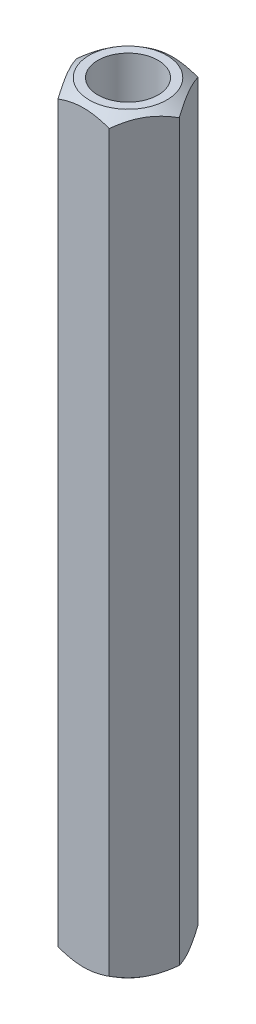
ISO-10303-21;
HEADER;
FILE_DESCRIPTION(('STEP AP214'),'2;1');
FILE_NAME('part.step','',(''),(''),'','','');
FILE_SCHEMA(('AUTOMOTIVE_DESIGN { 1 0 10303 214 1 1 1 1 }'));
ENDSEC;
DATA;
#1=APPLICATION_CONTEXT('core data for automotive mechanical design processes');
#2=APPLICATION_PROTOCOL_DEFINITION('international standard','automotive_design',2000,#1);
#3=PRODUCT_CONTEXT('',#1,'mechanical');
#4=PRODUCT('Part','Part','',(#3));
#5=PRODUCT_RELATED_PRODUCT_CATEGORY('part','',(#4));
#6=PRODUCT_DEFINITION_FORMATION('','',#4);
#7=PRODUCT_DEFINITION_CONTEXT('part definition',#1,'design');
#8=PRODUCT_DEFINITION('design','',#6,#7);
#9=PRODUCT_DEFINITION_SHAPE('','',#8);
#10=(LENGTH_UNIT() NAMED_UNIT(*) SI_UNIT(.MILLI.,.METRE.));
#11=(NAMED_UNIT(*) PLANE_ANGLE_UNIT() SI_UNIT($,.RADIAN.));
#12=(NAMED_UNIT(*) SI_UNIT($,.STERADIAN.) SOLID_ANGLE_UNIT());
#13=UNCERTAINTY_MEASURE_WITH_UNIT(LENGTH_MEASURE(1.E-05),#10,'distance_accuracy_value','');
#14=(GEOMETRIC_REPRESENTATION_CONTEXT(3) GLOBAL_UNCERTAINTY_ASSIGNED_CONTEXT((#13)) GLOBAL_UNIT_ASSIGNED_CONTEXT((#10,
#11,#12)) REPRESENTATION_CONTEXT('',''));
#15=CARTESIAN_POINT('',(0.,0.,0.));
#16=DIRECTION('',(0.,0.,1.));
#17=DIRECTION('',(1.,0.,0.));
#18=AXIS2_PLACEMENT_3D('',#15,#16,#17);
#19=CARTESIAN_POINT('',(-1.7031832941094,50.,2.95));
#20=DIRECTION('',(0.,0.,-1.));
#21=DIRECTION('',(-1.,0.,0.));
#22=AXIS2_PLACEMENT_3D('',#19,#20,#21);
#23=PLANE('',#22);
#24=CARTESIAN_POINT('',(-4.05461232529674,48.2277686620064,2.95));
#25=CARTESIAN_POINT('',(-3.94621271231721,48.2914609210598,2.95));
#26=CARTESIAN_POINT('',(-3.837435847718,48.354522032527,2.95));
#27=CARTESIAN_POINT('',(-3.61895112298373,48.4790602429143,2.95));
#28=CARTESIAN_POINT('',(-3.50924307990902,48.5405370205299,2.95));
#29=CARTESIAN_POINT('',(-3.28804663612024,48.6619521609706,2.95));
#30=CARTESIAN_POINT('',(-3.17655129885157,48.7218779306985,2.95));
#31=CARTESIAN_POINT('',(-2.95229456012626,48.839303804544,2.95));
#32=CARTESIAN_POINT('',(-2.83953323129652,48.896804046917,2.95));
#33=CARTESIAN_POINT('',(-2.60770322605176,49.0111600537194,2.95));
#34=CARTESIAN_POINT('',(-2.48856977859005,49.0678852179029,2.95));
#35=CARTESIAN_POINT('',(-2.2483802067534,49.1771793231946,2.95));
#36=CARTESIAN_POINT('',(-2.12732383873497,49.229747732495,2.95));
#37=CARTESIAN_POINT('',(-1.8833121988441,49.3294459262429,2.95));
#38=CARTESIAN_POINT('',(-1.76036221516992,49.3765885306905,2.95));
#39=CARTESIAN_POINT('',(-1.51209893737175,49.4641079950337,2.95));
#40=CARTESIAN_POINT('',(-1.38678651289328,49.5044872925027,2.95));
#41=CARTESIAN_POINT('',(-1.12793775016924,49.5783931262297,2.95));
#42=CARTESIAN_POINT('',(-0.994286484547427,49.6115248217331,2.95));
#43=CARTESIAN_POINT('',(-0.724624612015141,49.6663377671345,2.95));
#44=CARTESIAN_POINT('',(-0.588614424081831,49.6880210293505,2.95));
#45=CARTESIAN_POINT('',(-0.317321711369485,49.7178689506704,2.95));
#46=CARTESIAN_POINT('',(-0.182063385223632,49.7262479355804,2.95));
#47=CARTESIAN_POINT('',(0.0886210559395453,49.7293612756643,2.95));
#48=CARTESIAN_POINT('',(0.224047174535356,49.7240953346481,2.95));
#49=CARTESIAN_POINT('',(0.482831942094902,49.7013906234424,2.95));
#50=CARTESIAN_POINT('',(0.606283120828392,49.6849676346196,2.95));
#51=CARTESIAN_POINT('',(0.851432997279108,49.6422336449972,2.95));
#52=CARTESIAN_POINT('',(0.973131613989001,49.6159221886441,2.95));
#53=CARTESIAN_POINT('',(1.21671308523253,49.554380559434,2.95));
#54=CARTESIAN_POINT('',(1.33855451810658,49.518988677576,2.95));
#55=CARTESIAN_POINT('',(1.51958072119215,49.4606517843694,2.95));
#56=CARTESIAN_POINT('',(1.5796325615635,49.4403316582886,2.95));
#57=CARTESIAN_POINT('',(1.6991806344264,49.3981238889795,2.95));
#58=CARTESIAN_POINT('',(1.75867689129756,49.3762363149014,2.95));
#59=CARTESIAN_POINT('',(1.94593537324239,49.304836423385,2.95));
#60=CARTESIAN_POINT('',(2.07272450894271,49.2527656618048,2.95));
#61=CARTESIAN_POINT('',(2.32412427122057,49.1435803755841,2.95));
#62=CARTESIAN_POINT('',(2.44873429467314,49.0864644802367,2.95));
#63=CARTESIAN_POINT('',(2.69619716344165,48.9682559046461,2.95));
#64=CARTESIAN_POINT('',(2.81904813152007,48.9071593134961,2.95));
#65=CARTESIAN_POINT('',(3.06315160061721,48.7818944847195,2.95));
#66=CARTESIAN_POINT('',(3.18440424672197,48.7177265283761,2.95));
#67=CARTESIAN_POINT('',(3.42614112560949,48.5866493682499,2.95));
#68=CARTESIAN_POINT('',(3.54661920487956,48.5197288520524,2.95));
#69=CARTESIAN_POINT('',(3.78645737066542,48.3839102145454,2.95));
#70=CARTESIAN_POINT('',(3.90581741936779,48.3150120266663,2.95));
#71=CARTESIAN_POINT('',(4.26236561852274,48.1060127891548,2.95));
#72=CARTESIAN_POINT('',(4.49815806704329,47.9635320189086,2.95));
#73=CARTESIAN_POINT('',(4.9413519549688,47.6901559535697,2.95));
#74=CARTESIAN_POINT('',(5.14902965679854,47.5597049345302,2.95));
#75=CARTESIAN_POINT('',(5.56281584655362,47.2962746718772,2.95));
#76=CARTESIAN_POINT('',(5.76892410448383,47.1632950673296,2.95));
#77=CARTESIAN_POINT('',(6.17794018033544,46.89674199216,2.95));
#78=CARTESIAN_POINT('',(6.38085972863554,46.7631864735119,2.95));
#79=CARTESIAN_POINT('',(6.78569812956608,46.4946542040007,2.95));
#80=CARTESIAN_POINT('',(6.9876171753043,46.3596777444676,2.95));
#81=CARTESIAN_POINT('',(7.18917863706093,46.2241749072125,2.95));
#82=B_SPLINE_CURVE_WITH_KNOTS('',3,(#24,#25,#26,#27,#28,#29,#30,#31,#32,#33,#34,#35,#36,#37,#38,
#39,#40,#41,#42,#43,#44,#45,#46,#47,#48,#49,#50,#51,#52,#53,#54,#55,#56,#57,#58,#59,#60,#61,#62,
#63,#64,#65,#66,#67,#68,#69,#70,#71,#72,#73,#74,#75,#76,#77,#78,#79,#80,#81),.UNSPECIFIED.,.F.,
.F.,(4,2,2,2,2,2,2,2,2,2,2,2,2,2,2,2,2,2,2,2,2,2,2,2,2,2,2,2,4),(0.,0.377185912204267,
0.754447725599356,1.13416109637235,1.51385279408704,1.90963672952404,2.30547121919885,
2.7003503555372,3.0950868652229,3.50776306676646,3.92036670707722,4.32625348716091,
4.73214907789404,5.10531571028197,5.47849953625807,5.85885647181754,6.04902913686089,
6.23919341733104,6.6502298862926,7.0613783748244,7.47293707920044,7.88445816386253,
8.29788382471786,8.71132341810463,9.53773613971973,10.2734671856936,11.0093040513489,
11.7380779448787,12.4667052231439),.UNSPECIFIED.);
#83=CARTESIAN_POINT('',(-1.7031832941094,49.3963793454497,2.95));
#84=VERTEX_POINT('',#83);
#85=CARTESIAN_POINT('',(1.7031832941094,49.3963793454497,2.95));
#86=VERTEX_POINT('',#85);
#87=EDGE_CURVE('E87',#84,#86,#82,.T.);
#88=ORIENTED_EDGE('',*,*,#87,.F.);
#89=DIRECTION('',(0.,-1.,0.));
#90=VECTOR('',#89,1.);
#91=CARTESIAN_POINT('',(-1.7031832941094,50.,2.95));
#92=LINE('',#91,#90);
#93=CARTESIAN_POINT('',(-1.7031832941094,0.603620654550297,2.95));
#94=VERTEX_POINT('',#93);
#95=EDGE_CURVE('E56',#84,#94,#92,.T.);
#96=ORIENTED_EDGE('',*,*,#95,.T.);
#97=CARTESIAN_POINT('',(-4.05461232529675,1.77223133799356,2.95));
#98=CARTESIAN_POINT('',(-3.94621271231721,1.70853907894017,2.95));
#99=CARTESIAN_POINT('',(-3.837435847718,1.64547796747305,2.95));
#100=CARTESIAN_POINT('',(-3.61895112298373,1.52093975708568,2.95));
#101=CARTESIAN_POINT('',(-3.50924307990903,1.45946297947013,2.95));
#102=CARTESIAN_POINT('',(-3.28804663612024,1.33804783902941,2.95));
#103=CARTESIAN_POINT('',(-3.17655129885157,1.27812206930148,2.95));
#104=CARTESIAN_POINT('',(-2.95229456012626,1.16069619545603,2.95));
#105=CARTESIAN_POINT('',(-2.83953323129652,1.10319595308301,2.95));
#106=CARTESIAN_POINT('',(-2.60770322605176,0.988839946280621,2.95));
#107=CARTESIAN_POINT('',(-2.48856977859005,0.932114782097108,2.95));
#108=CARTESIAN_POINT('',(-2.2483802067534,0.822820676805411,2.95));
#109=CARTESIAN_POINT('',(-2.12732383873497,0.770252267505033,2.95));
#110=CARTESIAN_POINT('',(-1.8833121988441,0.670554073757091,2.95));
#111=CARTESIAN_POINT('',(-1.76036221516992,0.623411469309482,2.95));
#112=CARTESIAN_POINT('',(-1.51209893737175,0.535892004966346,2.95));
#113=CARTESIAN_POINT('',(-1.38678651289328,0.495512707497298,2.95));
#114=CARTESIAN_POINT('',(-1.12793775016924,0.421606873770254,2.95));
#115=CARTESIAN_POINT('',(-0.994286484547427,0.388475178266886,2.95));
#116=CARTESIAN_POINT('',(-0.724624612015141,0.333662232865514,2.95));
#117=CARTESIAN_POINT('',(-0.588614424081831,0.311978970649536,2.95));
#118=CARTESIAN_POINT('',(-0.317321711369485,0.282131049329576,2.95));
#119=CARTESIAN_POINT('',(-0.182063385223632,0.273752064419566,2.95));
#120=CARTESIAN_POINT('',(0.0886210559395456,0.270638724335665,2.95));
#121=CARTESIAN_POINT('',(0.224047174535357,0.275904665351887,2.95));
#122=CARTESIAN_POINT('',(0.482831942094901,0.29860937655757,2.95));
#123=CARTESIAN_POINT('',(0.606283120828391,0.315032365380413,2.95));
#124=CARTESIAN_POINT('',(0.851432997279107,0.357766355002783,2.95));
#125=CARTESIAN_POINT('',(0.973131613989,0.384077811355892,2.95));
#126=CARTESIAN_POINT('',(1.21671308523253,0.445619440565985,2.95));
#127=CARTESIAN_POINT('',(1.33855451810658,0.481011322424028,2.95));
#128=CARTESIAN_POINT('',(1.51958072119215,0.539348215630614,2.95));
#129=CARTESIAN_POINT('',(1.5796325615635,0.559668341711404,2.95));
#130=CARTESIAN_POINT('',(1.6991806344264,0.601876111020508,2.95));
#131=CARTESIAN_POINT('',(1.75867689129756,0.623763685098642,2.95));
#132=CARTESIAN_POINT('',(1.94593537324239,0.695163576615002,2.95));
#133=CARTESIAN_POINT('',(2.07272450894271,0.747234338195169,2.95));
#134=CARTESIAN_POINT('',(2.32412427122057,0.856419624415884,2.95));
#135=CARTESIAN_POINT('',(2.44873429467314,0.913535519763325,2.95));
#136=CARTESIAN_POINT('',(2.69619716344164,1.03174409535388,2.95));
#137=CARTESIAN_POINT('',(2.81904813152007,1.09284068650394,2.95));
#138=CARTESIAN_POINT('',(3.06315160061721,1.21810551528055,2.95));
#139=CARTESIAN_POINT('',(3.18440424672197,1.28227347162389,2.95));
#140=CARTESIAN_POINT('',(3.42614112560949,1.41335063175011,2.95));
#141=CARTESIAN_POINT('',(3.54661920487956,1.48027114794761,2.95));
#142=CARTESIAN_POINT('',(3.78645737066541,1.61608978545456,2.95));
#143=CARTESIAN_POINT('',(3.90581741936779,1.68498797333371,2.95));
#144=CARTESIAN_POINT('',(4.26236561852274,1.89398721084525,2.95));
#145=CARTESIAN_POINT('',(4.49815806704329,2.0364679810914,2.95));
#146=CARTESIAN_POINT('',(4.9413519549688,2.30984404643027,2.95));
#147=CARTESIAN_POINT('',(5.14902965679854,2.44029506546977,2.95));
#148=CARTESIAN_POINT('',(5.56281584655362,2.70372532812276,2.95));
#149=CARTESIAN_POINT('',(5.76892410448382,2.83670493267039,2.95));
#150=CARTESIAN_POINT('',(6.17794018033544,3.10325800784,2.95));
#151=CARTESIAN_POINT('',(6.38085972863554,3.23681352648813,2.95));
#152=CARTESIAN_POINT('',(6.78569812956608,3.50534579599933,2.95));
#153=CARTESIAN_POINT('',(6.9876171753043,3.64032225553239,2.95));
#154=CARTESIAN_POINT('',(7.18917863706093,3.77582509278753,2.95));
#155=B_SPLINE_CURVE_WITH_KNOTS('',3,(#97,#98,#99,#100,#101,#102,#103,#104,#105,#106,#107,#108,
#109,#110,#111,#112,#113,#114,#115,#116,#117,#118,#119,#120,#121,#122,#123,#124,#125,#126,#127,
#128,#129,#130,#131,#132,#133,#134,#135,#136,#137,#138,#139,#140,#141,#142,#143,#144,#145,#146,
#147,#148,#149,#150,#151,#152,#153,#154),.UNSPECIFIED.,.F.,.F.,(4,2,2,2,2,2,2,2,2,2,2,2,2,2,2,2,
2,2,2,2,2,2,2,2,2,2,2,2,4),(0.,0.377185912204268,0.754447725599353,1.13416109637235,
1.51385279408704,1.90963672952404,2.30547121919885,2.7003503555372,3.0950868652229,
3.50776306676646,3.92036670707722,4.32625348716091,4.73214907789404,5.10531571028196,
5.47849953625807,5.85885647181753,6.04902913686089,6.23919341733104,6.6502298862926,
7.06137837482439,7.47293707920044,7.88445816386253,8.29788382471786,8.71132341810463,
9.53773613971974,10.2734671856936,11.0093040513489,11.7380779448787,12.4667052231439),.UNSPECIFIED.);
#156=CARTESIAN_POINT('',(1.7031832941094,0.603620654550297,2.95));
#157=VERTEX_POINT('',#156);
#158=EDGE_CURVE('E158',#157,#94,#155,.F.);
#159=ORIENTED_EDGE('',*,*,#158,.F.);
#160=DIRECTION('',(0.,-1.,0.));
#161=VECTOR('',#160,1.);
#162=CARTESIAN_POINT('',(1.7031832941094,50.,2.95));
#163=LINE('',#162,#161);
#164=EDGE_CURVE('E41',#86,#157,#163,.T.);
#165=ORIENTED_EDGE('',*,*,#164,.F.);
#166=EDGE_LOOP('',(#88,#96,#159,#165));
#167=FACE_BOUND('',#166,.T.);
#168=ADVANCED_FACE('F32',(#167),#23,.F.);
#169=CARTESIAN_POINT('',(1.7031832941094,50.,2.95));
#170=DIRECTION('',(-0.866025403784439,0.,-0.5));
#171=DIRECTION('',(-0.5,0.,0.866025403784439));
#172=AXIS2_PLACEMENT_3D('',#169,#170,#171);
#173=PLANE('',#172);
#174=CARTESIAN_POINT('',(1.70306782405556,49.3962954157984,2.9502));
#175=CARTESIAN_POINT('',(1.77970621045705,49.4519964489669,2.81745842094253));
#176=CARTESIAN_POINT('',(1.85738114151486,49.5028360423618,2.68292149387599));
#177=CARTESIAN_POINT('',(2.01490828956404,49.5914223642712,2.41007646988337));
#178=CARTESIAN_POINT('',(2.09476835702137,49.6291125297827,2.2717547755514));
#179=CARTESIAN_POINT('',(2.25294057782611,49.6863470943256,1.99779245277159));
#180=CARTESIAN_POINT('',(2.33119000824908,49.7065470927573,1.86226046361568));
#181=CARTESIAN_POINT('',(2.44893544842869,49.7233149853333,1.65831937886504));
#182=CARTESIAN_POINT('',(2.48821044965547,49.7266519832533,1.59029308127293));
#183=CARTESIAN_POINT('',(2.56679020518234,49.7287619405938,1.45418895225404));
#184=CARTESIAN_POINT('',(2.60609495733059,49.7275352034545,1.38611112455438));
#185=CARTESIAN_POINT('',(2.7093655095579,49.7183265008372,1.20724128117097));
#186=CARTESIAN_POINT('',(2.77325369114515,49.7065726983295,1.09658370465868));
#187=CARTESIAN_POINT('',(2.90026705653299,49.6719137524718,0.876590102566627));
#188=CARTESIAN_POINT('',(2.96339202090339,49.6490054767584,0.767254457051116));
#189=CARTESIAN_POINT('',(3.05834081789005,49.607008810721,0.602798316552675));
#190=CARTESIAN_POINT('',(3.09056559618572,49.5914141976082,0.546983363281939));
#191=CARTESIAN_POINT('',(3.15470346140481,49.5579163092915,0.435893322033459));
#192=CARTESIAN_POINT('',(3.18661664853758,49.5400138045173,0.380618060488058));
#193=CARTESIAN_POINT('',(3.25003080045298,49.5021938973924,0.270781527451697));
#194=CARTESIAN_POINT('',(3.28153275054044,49.4822830545909,0.216218549362707));
#195=CARTESIAN_POINT('',(3.34423406533642,49.4406172200057,0.107616686434712));
#196=CARTESIAN_POINT('',(3.37543340165151,49.4188620570047,0.0535778507745416));
#197=CARTESIAN_POINT('',(3.40648205827263,49.3962954157984,-0.000200000000000313));
#198=B_SPLINE_CURVE_WITH_KNOTS('',3,(#174,#175,#176,#177,#178,#179,#180,#181,#182,#183,#184,
#185,#186,#187,#188,#189,#190,#191,#192,#193,#194,#195,#196,#197),.UNSPECIFIED.,.F.,.F.,(4,2,2,
2,2,2,2,2,2,2,2,4),(0.,0.489602434305842,0.981285680305235,1.45362365908862,1.6893705060195,
1.92510167855345,2.30947632253454,2.69395896767855,2.8928513374988,3.09167748336949,
3.28987405815011,3.48808905269054),.UNSPECIFIED.);
#199=CARTESIAN_POINT('',(3.40636658821879,49.3963793454497,0.));
#200=VERTEX_POINT('',#199);
#201=EDGE_CURVE('E94',#86,#200,#198,.T.);
#202=ORIENTED_EDGE('',*,*,#201,.F.);
#203=ORIENTED_EDGE('',*,*,#164,.T.);
#204=CARTESIAN_POINT('',(3.40648205827263,0.603704584201615,-0.000200000000000409));
#205=CARTESIAN_POINT('',(3.32984367187114,0.54800355103306,0.132541579057473));
#206=CARTESIAN_POINT('',(3.25216874081333,0.49716395763824,0.267078506124008));
#207=CARTESIAN_POINT('',(3.09464159276415,0.408577635728791,0.539923530116624));
#208=CARTESIAN_POINT('',(3.01478152530682,0.370887470217291,0.678245224448596));
#209=CARTESIAN_POINT('',(2.85660930450208,0.313652905674349,0.952207547228405));
#210=CARTESIAN_POINT('',(2.77835987407911,0.293452907242673,1.08773953638432));
#211=CARTESIAN_POINT('',(2.6606144338995,0.276685014666744,1.29168062113496));
#212=CARTESIAN_POINT('',(2.62133943267272,0.273348016746704,1.35970691872707));
#213=CARTESIAN_POINT('',(2.54275967714585,0.271238059406191,1.49581104774596));
#214=CARTESIAN_POINT('',(2.5034549249976,0.272464796545505,1.56388887544562));
#215=CARTESIAN_POINT('',(2.40018437277029,0.281673499162782,1.74275871882903));
#216=CARTESIAN_POINT('',(2.33629619118304,0.293427301670511,1.85341629534132));
#217=CARTESIAN_POINT('',(2.2092828257952,0.328086247528173,2.07340989743337));
#218=CARTESIAN_POINT('',(2.1461578614248,0.350994523241586,2.18274554294888));
#219=CARTESIAN_POINT('',(2.05120906443814,0.392991189279003,2.34720168344732));
#220=CARTESIAN_POINT('',(2.01898428614247,0.408585802391812,2.40301663671806));
#221=CARTESIAN_POINT('',(1.95484642092337,0.442083690708495,2.51410667796654));
#222=CARTESIAN_POINT('',(1.92293323379061,0.459986195482685,2.56938193951194));
#223=CARTESIAN_POINT('',(1.85951908187521,0.497806102607591,2.6792184725483));
#224=CARTESIAN_POINT('',(1.82801713178775,0.517716945409077,2.73378145063729));
#225=CARTESIAN_POINT('',(1.76531581699177,0.559382779994263,2.84238331356529));
#226=CARTESIAN_POINT('',(1.73411648067668,0.581137942995335,2.89642214922546));
#227=CARTESIAN_POINT('',(1.70306782405556,0.603704584201615,2.9502));
#228=B_SPLINE_CURVE_WITH_KNOTS('',3,(#204,#205,#206,#207,#208,#209,#210,#211,#212,#213,#214,
#215,#216,#217,#218,#219,#220,#221,#222,#223,#224,#225,#226,#227),.UNSPECIFIED.,.F.,.F.,(4,2,2,
2,2,2,2,2,2,2,2,4),(0.,0.489602434305841,0.981285680305235,1.45362365908862,1.6893705060195,
1.92510167855345,2.30947632253454,2.69395896767855,2.8928513374988,3.09167748336949,
3.28987405815011,3.48808905269054),.UNSPECIFIED.);
#229=CARTESIAN_POINT('',(3.40636658821879,0.603620654550297,0.));
#230=VERTEX_POINT('',#229);
#231=EDGE_CURVE('E153',#230,#157,#228,.T.);
#232=ORIENTED_EDGE('',*,*,#231,.F.);
#233=DIRECTION('',(0.,-1.,0.));
#234=VECTOR('',#233,1.);
#235=CARTESIAN_POINT('',(3.40636658821879,50.,0.));
#236=LINE('',#235,#234);
#237=EDGE_CURVE('E111',#200,#230,#236,.T.);
#238=ORIENTED_EDGE('',*,*,#237,.F.);
#239=EDGE_LOOP('',(#202,#203,#232,#238));
#240=FACE_BOUND('',#239,.T.);
#241=ADVANCED_FACE('F163',(#240),#173,.F.);
#242=CARTESIAN_POINT('',(3.40636658821879,50.,0.));
#243=DIRECTION('',(-0.866025403784439,0.,0.5));
#244=DIRECTION('',(0.5,0.,0.866025403784439));
#245=AXIS2_PLACEMENT_3D('',#242,#243,#244);
#246=PLANE('',#245);
#247=CARTESIAN_POINT('',(3.40648205827263,49.3962954157984,0.000199999999999513));
#248=CARTESIAN_POINT('',(3.32984367187114,49.4519964489669,-0.132541579057475));
#249=CARTESIAN_POINT('',(3.25216874081333,49.5028360423618,-0.26707850612401));
#250=CARTESIAN_POINT('',(3.09464159276415,49.5914223642712,-0.539923530116626));
#251=CARTESIAN_POINT('',(3.01478152530682,49.6291125297827,-0.678245224448597));
#252=CARTESIAN_POINT('',(2.85660930450208,49.6863470943257,-0.952207547228406));
#253=CARTESIAN_POINT('',(2.77835987407911,49.7065470927573,-1.08773953638432));
#254=CARTESIAN_POINT('',(2.6606144338995,49.7233149853333,-1.29168062113497));
#255=CARTESIAN_POINT('',(2.62133943267272,49.7266519832533,-1.35970691872707));
#256=CARTESIAN_POINT('',(2.54275967714585,49.7287619405938,-1.49581104774596));
#257=CARTESIAN_POINT('',(2.5034549249976,49.7275352034545,-1.56388887544562));
#258=CARTESIAN_POINT('',(2.40018437277029,49.7183265008372,-1.74275871882903));
#259=CARTESIAN_POINT('',(2.33629619118304,49.7065726983295,-1.85341629534132));
#260=CARTESIAN_POINT('',(2.2092828257952,49.6719137524718,-2.07340989743337));
#261=CARTESIAN_POINT('',(2.1461578614248,49.6490054767584,-2.18274554294888));
#262=CARTESIAN_POINT('',(2.05120906443814,49.607008810721,-2.34720168344733));
#263=CARTESIAN_POINT('',(2.01898428614247,49.5914141976082,-2.40301663671806));
#264=CARTESIAN_POINT('',(1.95484642092337,49.5579163092915,-2.51410667796654));
#265=CARTESIAN_POINT('',(1.92293323379061,49.5400138045173,-2.56938193951194));
#266=CARTESIAN_POINT('',(1.85951908187521,49.5021938973924,-2.6792184725483));
#267=CARTESIAN_POINT('',(1.82801713178775,49.4822830545909,-2.73378145063729));
#268=CARTESIAN_POINT('',(1.76531581699177,49.4406172200057,-2.84238331356529));
#269=CARTESIAN_POINT('',(1.73411648067668,49.4188620570047,-2.89642214922546));
#270=CARTESIAN_POINT('',(1.70306782405556,49.3962954157984,-2.9502));
#271=B_SPLINE_CURVE_WITH_KNOTS('',3,(#247,#248,#249,#250,#251,#252,#253,#254,#255,#256,#257,
#258,#259,#260,#261,#262,#263,#264,#265,#266,#267,#268,#269,#270),.UNSPECIFIED.,.F.,.F.,(4,2,2,
2,2,2,2,2,2,2,2,4),(0.,0.48960243430584,0.981285680305235,1.45362365908862,1.6893705060195,
1.92510167855345,2.30947632253454,2.69395896767855,2.8928513374988,3.09167748336949,
3.28987405815011,3.48808905269054),.UNSPECIFIED.);
#272=CARTESIAN_POINT('',(1.7031832941094,49.3963793454497,-2.95));
#273=VERTEX_POINT('',#272);
#274=EDGE_CURVE('E175',#200,#273,#271,.T.);
#275=ORIENTED_EDGE('',*,*,#274,.F.);
#276=ORIENTED_EDGE('',*,*,#237,.T.);
#277=CARTESIAN_POINT('',(1.70306782405556,0.603704584201616,-2.9502));
#278=CARTESIAN_POINT('',(1.77970621045705,0.548003551033062,-2.81745842094253));
#279=CARTESIAN_POINT('',(1.85738114151486,0.497163957638241,-2.68292149387599));
#280=CARTESIAN_POINT('',(2.01490828956404,0.408577635728792,-2.41007646988338));
#281=CARTESIAN_POINT('',(2.09476835702137,0.370887470217291,-2.2717547755514));
#282=CARTESIAN_POINT('',(2.25294057782611,0.31365290567435,-1.99779245277159));
#283=CARTESIAN_POINT('',(2.33119000824908,0.293452907242674,-1.86226046361568));
#284=CARTESIAN_POINT('',(2.44893544842869,0.276685014666745,-1.65831937886504));
#285=CARTESIAN_POINT('',(2.48821044965547,0.273348016746705,-1.59029308127293));
#286=CARTESIAN_POINT('',(2.56679020518234,0.271238059406192,-1.45418895225404));
#287=CARTESIAN_POINT('',(2.60609495733059,0.272464796545505,-1.38611112455438));
#288=CARTESIAN_POINT('',(2.7093655095579,0.281673499162782,-1.20724128117097));
#289=CARTESIAN_POINT('',(2.77325369114515,0.293427301670511,-1.09658370465868));
#290=CARTESIAN_POINT('',(2.90026705653299,0.328086247528173,-0.876590102566629));
#291=CARTESIAN_POINT('',(2.96339202090339,0.350994523241586,-0.767254457051119));
#292=CARTESIAN_POINT('',(3.05834081789005,0.392991189279004,-0.602798316552677));
#293=CARTESIAN_POINT('',(3.09056559618572,0.408585802391813,-0.54698336328194));
#294=CARTESIAN_POINT('',(3.15470346140481,0.442083690708496,-0.435893322033459));
#295=CARTESIAN_POINT('',(3.18661664853758,0.459986195482686,-0.380618060488059));
#296=CARTESIAN_POINT('',(3.25003080045298,0.497806102607591,-0.270781527451698));
#297=CARTESIAN_POINT('',(3.28153275054044,0.517716945409077,-0.216218549362708));
#298=CARTESIAN_POINT('',(3.34423406533642,0.559382779994264,-0.107616686434712));
#299=CARTESIAN_POINT('',(3.37543340165151,0.581137942995336,-0.0535778507745417));
#300=CARTESIAN_POINT('',(3.40648205827263,0.603704584201615,0.000200000000000005));
#301=B_SPLINE_CURVE_WITH_KNOTS('',3,(#277,#278,#279,#280,#281,#282,#283,#284,#285,#286,#287,
#288,#289,#290,#291,#292,#293,#294,#295,#296,#297,#298,#299,#300),.UNSPECIFIED.,.F.,.F.,(4,2,2,
2,2,2,2,2,2,2,2,4),(0.,0.489602434305841,0.981285680305235,1.45362365908862,1.6893705060195,
1.92510167855345,2.30947632253454,2.69395896767855,2.8928513374988,3.09167748336949,
3.28987405815011,3.48808905269054),.UNSPECIFIED.);
#302=CARTESIAN_POINT('',(1.7031832941094,0.603620654550297,-2.95));
#303=VERTEX_POINT('',#302);
#304=EDGE_CURVE('E147',#303,#230,#301,.T.);
#305=ORIENTED_EDGE('',*,*,#304,.F.);
#306=DIRECTION('',(0.,-1.,0.));
#307=VECTOR('',#306,1.);
#308=CARTESIAN_POINT('',(1.7031832941094,50.,-2.95));
#309=LINE('',#308,#307);
#310=EDGE_CURVE('E109',#273,#303,#309,.T.);
#311=ORIENTED_EDGE('',*,*,#310,.F.);
#312=EDGE_LOOP('',(#275,#276,#305,#311));
#313=FACE_BOUND('',#312,.T.);
#314=ADVANCED_FACE('F166',(#313),#246,.F.);
#315=CARTESIAN_POINT('',(1.7031832941094,50.,-2.95));
#316=DIRECTION('',(0.,0.,1.));
#317=DIRECTION('',(1.,0.,0.));
#318=AXIS2_PLACEMENT_3D('',#315,#316,#317);
#319=PLANE('',#318);
#320=CARTESIAN_POINT('',(-4.05461232529675,48.2277686620064,-2.95));
#321=CARTESIAN_POINT('',(-3.94621271231721,48.2914609210598,-2.95));
#322=CARTESIAN_POINT('',(-3.837435847718,48.354522032527,-2.95));
#323=CARTESIAN_POINT('',(-3.61895112298373,48.4790602429143,-2.95));
#324=CARTESIAN_POINT('',(-3.50924307990903,48.5405370205299,-2.95));
#325=CARTESIAN_POINT('',(-3.28804663612024,48.6619521609706,-2.95));
#326=CARTESIAN_POINT('',(-3.17655129885158,48.7218779306985,-2.95));
#327=CARTESIAN_POINT('',(-2.95229456012626,48.839303804544,-2.95));
#328=CARTESIAN_POINT('',(-2.83953323129652,48.896804046917,-2.95));
#329=CARTESIAN_POINT('',(-2.60770322605176,49.0111600537194,-2.95));
#330=CARTESIAN_POINT('',(-2.48856977859005,49.0678852179029,-2.95));
#331=CARTESIAN_POINT('',(-2.2483802067534,49.1771793231946,-2.95));
#332=CARTESIAN_POINT('',(-2.12732383873497,49.229747732495,-2.95));
#333=CARTESIAN_POINT('',(-1.8833121988441,49.3294459262429,-2.95));
#334=CARTESIAN_POINT('',(-1.76036221516992,49.3765885306905,-2.95));
#335=CARTESIAN_POINT('',(-1.51209893737175,49.4641079950337,-2.95));
#336=CARTESIAN_POINT('',(-1.38678651289328,49.5044872925027,-2.95));
#337=CARTESIAN_POINT('',(-1.12793775016924,49.5783931262297,-2.95));
#338=CARTESIAN_POINT('',(-0.994286484547427,49.6115248217331,-2.95));
#339=CARTESIAN_POINT('',(-0.724624612015141,49.6663377671345,-2.95));
#340=CARTESIAN_POINT('',(-0.588614424081831,49.6880210293505,-2.95));
#341=CARTESIAN_POINT('',(-0.317321711369485,49.7178689506704,-2.95));
#342=CARTESIAN_POINT('',(-0.182063385223632,49.7262479355804,-2.95));
#343=CARTESIAN_POINT('',(0.0886210559395454,49.7293612756643,-2.95));
#344=CARTESIAN_POINT('',(0.224047174535356,49.7240953346481,-2.95));
#345=CARTESIAN_POINT('',(0.482831942094901,49.7013906234424,-2.95));
#346=CARTESIAN_POINT('',(0.606283120828391,49.6849676346196,-2.95));
#347=CARTESIAN_POINT('',(0.851432997279107,49.6422336449972,-2.95));
#348=CARTESIAN_POINT('',(0.973131613989,49.6159221886441,-2.95));
#349=CARTESIAN_POINT('',(1.21671308523253,49.554380559434,-2.95));
#350=CARTESIAN_POINT('',(1.33855451810658,49.518988677576,-2.95));
#351=CARTESIAN_POINT('',(1.51958072119215,49.4606517843694,-2.95));
#352=CARTESIAN_POINT('',(1.5796325615635,49.4403316582886,-2.95));
#353=CARTESIAN_POINT('',(1.6991806344264,49.3981238889795,-2.95));
#354=CARTESIAN_POINT('',(1.75867689129756,49.3762363149014,-2.95));
#355=CARTESIAN_POINT('',(1.94593537324239,49.304836423385,-2.95));
#356=CARTESIAN_POINT('',(2.07272450894271,49.2527656618048,-2.95));
#357=CARTESIAN_POINT('',(2.32412427122057,49.1435803755841,-2.95));
#358=CARTESIAN_POINT('',(2.44873429467314,49.0864644802367,-2.95));
#359=CARTESIAN_POINT('',(2.69619716344164,48.9682559046461,-2.95));
#360=CARTESIAN_POINT('',(2.81904813152006,48.9071593134961,-2.95));
#361=CARTESIAN_POINT('',(3.0631516006172,48.7818944847195,-2.95));
#362=CARTESIAN_POINT('',(3.18440424672196,48.7177265283761,-2.95));
#363=CARTESIAN_POINT('',(3.42614112560949,48.5866493682499,-2.95));
#364=CARTESIAN_POINT('',(3.54661920487955,48.5197288520524,-2.95));
#365=CARTESIAN_POINT('',(3.78645737066541,48.3839102145454,-2.95));
#366=CARTESIAN_POINT('',(3.90581741936779,48.3150120266663,-2.95));
#367=CARTESIAN_POINT('',(4.26236561852274,48.1060127891548,-2.95));
#368=CARTESIAN_POINT('',(4.49815806704329,47.9635320189086,-2.95));
#369=CARTESIAN_POINT('',(4.9413519549688,47.6901559535697,-2.95));
#370=CARTESIAN_POINT('',(5.14902965679854,47.5597049345302,-2.95));
#371=CARTESIAN_POINT('',(5.56281584655362,47.2962746718772,-2.95));
#372=CARTESIAN_POINT('',(5.76892410448383,47.1632950673296,-2.95));
#373=CARTESIAN_POINT('',(6.17794018033544,46.89674199216,-2.95));
#374=CARTESIAN_POINT('',(6.38085972863554,46.7631864735119,-2.95));
#375=CARTESIAN_POINT('',(6.78569812956608,46.4946542040007,-2.95));
#376=CARTESIAN_POINT('',(6.98761717530431,46.3596777444676,-2.95));
#377=CARTESIAN_POINT('',(7.18917863706093,46.2241749072125,-2.95));
#378=B_SPLINE_CURVE_WITH_KNOTS('',3,(#320,#321,#322,#323,#324,#325,#326,#327,#328,#329,#330,
#331,#332,#333,#334,#335,#336,#337,#338,#339,#340,#341,#342,#343,#344,#345,#346,#347,#348,#349,
#350,#351,#352,#353,#354,#355,#356,#357,#358,#359,#360,#361,#362,#363,#364,#365,#366,#367,#368,
#369,#370,#371,#372,#373,#374,#375,#376,#377),.UNSPECIFIED.,.F.,.F.,(4,2,2,2,2,2,2,2,2,2,2,2,2,
2,2,2,2,2,2,2,2,2,2,2,2,2,2,2,4),(0.,0.377185912204266,0.754447725599354,1.13416109637235,
1.51385279408704,1.90963672952405,2.30547121919885,2.70035035553721,3.0950868652229,
3.50776306676646,3.92036670707722,4.32625348716091,4.73214907789404,5.10531571028196,
5.47849953625807,5.85885647181753,6.04902913686089,6.23919341733104,6.6502298862926,
7.06137837482439,7.47293707920044,7.88445816386252,8.29788382471786,8.71132341810463,
9.53773613971973,10.2734671856936,11.0093040513489,11.7380779448787,12.4667052231439),.UNSPECIFIED.);
#379=CARTESIAN_POINT('',(-1.7031832941094,49.3963793454497,-2.95));
#380=VERTEX_POINT('',#379);
#381=EDGE_CURVE('E183',#273,#380,#378,.F.);
#382=ORIENTED_EDGE('',*,*,#381,.F.);
#383=ORIENTED_EDGE('',*,*,#310,.T.);
#384=CARTESIAN_POINT('',(-4.05461232529675,1.77223133799356,-2.95));
#385=CARTESIAN_POINT('',(-3.94621271231721,1.70853907894017,-2.95));
#386=CARTESIAN_POINT('',(-3.837435847718,1.64547796747305,-2.95));
#387=CARTESIAN_POINT('',(-3.61895112298373,1.52093975708568,-2.95));
#388=CARTESIAN_POINT('',(-3.50924307990903,1.45946297947013,-2.95));
#389=CARTESIAN_POINT('',(-3.28804663612024,1.33804783902941,-2.95));
#390=CARTESIAN_POINT('',(-3.17655129885158,1.27812206930148,-2.95));
#391=CARTESIAN_POINT('',(-2.95229456012626,1.16069619545603,-2.95));
#392=CARTESIAN_POINT('',(-2.83953323129652,1.10319595308301,-2.95));
#393=CARTESIAN_POINT('',(-2.60770322605176,0.988839946280621,-2.95));
#394=CARTESIAN_POINT('',(-2.48856977859005,0.932114782097108,-2.95));
#395=CARTESIAN_POINT('',(-2.2483802067534,0.822820676805411,-2.95));
#396=CARTESIAN_POINT('',(-2.12732383873497,0.770252267505034,-2.95));
#397=CARTESIAN_POINT('',(-1.8833121988441,0.670554073757091,-2.95));
#398=CARTESIAN_POINT('',(-1.76036221516993,0.623411469309482,-2.95));
#399=CARTESIAN_POINT('',(-1.51209893737175,0.535892004966346,-2.95));
#400=CARTESIAN_POINT('',(-1.38678651289328,0.495512707497297,-2.95));
#401=CARTESIAN_POINT('',(-1.12793775016924,0.421606873770255,-2.95));
#402=CARTESIAN_POINT('',(-0.994286484547428,0.388475178266886,-2.95));
#403=CARTESIAN_POINT('',(-0.724624612015142,0.333662232865514,-2.95));
#404=CARTESIAN_POINT('',(-0.588614424081832,0.311978970649536,-2.95));
#405=CARTESIAN_POINT('',(-0.317321711369486,0.282131049329576,-2.95));
#406=CARTESIAN_POINT('',(-0.182063385223632,0.273752064419567,-2.95));
#407=CARTESIAN_POINT('',(0.0886210559395454,0.270638724335665,-2.95));
#408=CARTESIAN_POINT('',(0.224047174535356,0.275904665351887,-2.95));
#409=CARTESIAN_POINT('',(0.482831942094901,0.298609376557571,-2.95));
#410=CARTESIAN_POINT('',(0.606283120828391,0.315032365380413,-2.95));
#411=CARTESIAN_POINT('',(0.851432997279107,0.357766355002784,-2.95));
#412=CARTESIAN_POINT('',(0.973131613989,0.384077811355892,-2.95));
#413=CARTESIAN_POINT('',(1.21671308523252,0.445619440565985,-2.95));
#414=CARTESIAN_POINT('',(1.33855451810658,0.481011322424028,-2.95));
#415=CARTESIAN_POINT('',(1.51958072119215,0.539348215630614,-2.95));
#416=CARTESIAN_POINT('',(1.5796325615635,0.559668341711405,-2.95));
#417=CARTESIAN_POINT('',(1.6991806344264,0.601876111020509,-2.95));
#418=CARTESIAN_POINT('',(1.75867689129756,0.623763685098642,-2.95));
#419=CARTESIAN_POINT('',(1.94593537324239,0.695163576615002,-2.95));
#420=CARTESIAN_POINT('',(2.07272450894271,0.747234338195169,-2.95));
#421=CARTESIAN_POINT('',(2.32412427122057,0.856419624415885,-2.95));
#422=CARTESIAN_POINT('',(2.44873429467314,0.913535519763325,-2.95));
#423=CARTESIAN_POINT('',(2.69619716344164,1.03174409535388,-2.95));
#424=CARTESIAN_POINT('',(2.81904813152006,1.09284068650394,-2.95));
#425=CARTESIAN_POINT('',(3.06315160061721,1.21810551528055,-2.95));
#426=CARTESIAN_POINT('',(3.18440424672196,1.28227347162389,-2.95));
#427=CARTESIAN_POINT('',(3.42614112560949,1.41335063175011,-2.95));
#428=CARTESIAN_POINT('',(3.54661920487955,1.48027114794761,-2.95));
#429=CARTESIAN_POINT('',(3.78645737066541,1.61608978545456,-2.95));
#430=CARTESIAN_POINT('',(3.90581741936779,1.68498797333371,-2.95));
#431=CARTESIAN_POINT('',(4.26236561852274,1.89398721084525,-2.95));
#432=CARTESIAN_POINT('',(4.49815806704329,2.0364679810914,-2.95));
#433=CARTESIAN_POINT('',(4.9413519549688,2.30984404643027,-2.95));
#434=CARTESIAN_POINT('',(5.14902965679854,2.44029506546977,-2.95));
#435=CARTESIAN_POINT('',(5.56281584655362,2.70372532812275,-2.95));
#436=CARTESIAN_POINT('',(5.76892410448382,2.83670493267039,-2.95));
#437=CARTESIAN_POINT('',(6.17794018033544,3.10325800784,-2.95));
#438=CARTESIAN_POINT('',(6.38085972863554,3.23681352648813,-2.95));
#439=CARTESIAN_POINT('',(6.78569812956608,3.50534579599933,-2.95));
#440=CARTESIAN_POINT('',(6.9876171753043,3.64032225553239,-2.95));
#441=CARTESIAN_POINT('',(7.18917863706093,3.77582509278754,-2.95));
#442=B_SPLINE_CURVE_WITH_KNOTS('',3,(#384,#385,#386,#387,#388,#389,#390,#391,#392,#393,#394,
#395,#396,#397,#398,#399,#400,#401,#402,#403,#404,#405,#406,#407,#408,#409,#410,#411,#412,#413,
#414,#415,#416,#417,#418,#419,#420,#421,#422,#423,#424,#425,#426,#427,#428,#429,#430,#431,#432,
#433,#434,#435,#436,#437,#438,#439,#440,#441),.UNSPECIFIED.,.F.,.F.,(4,2,2,2,2,2,2,2,2,2,2,2,2,
2,2,2,2,2,2,2,2,2,2,2,2,2,2,2,4),(0.,0.377185912204268,0.754447725599353,1.13416109637235,
1.51385279408704,1.90963672952405,2.30547121919885,2.7003503555372,3.0950868652229,
3.50776306676646,3.92036670707722,4.32625348716091,4.73214907789404,5.10531571028197,
5.47849953625807,5.85885647181753,6.04902913686089,6.23919341733104,6.6502298862926,
7.0613783748244,7.47293707920044,7.88445816386253,8.29788382471786,8.71132341810463,
9.53773613971974,10.2734671856936,11.0093040513489,11.7380779448787,12.4667052231439),.UNSPECIFIED.);
#443=CARTESIAN_POINT('',(-1.7031832941094,0.603620654550297,-2.95));
#444=VERTEX_POINT('',#443);
#445=EDGE_CURVE('E141',#444,#303,#442,.T.);
#446=ORIENTED_EDGE('',*,*,#445,.F.);
#447=DIRECTION('',(0.,-1.,0.));
#448=VECTOR('',#447,1.);
#449=CARTESIAN_POINT('',(-1.7031832941094,50.,-2.95));
#450=LINE('',#449,#448);
#451=EDGE_CURVE('E101',#380,#444,#450,.T.);
#452=ORIENTED_EDGE('',*,*,#451,.F.);
#453=EDGE_LOOP('',(#382,#383,#446,#452));
#454=FACE_BOUND('',#453,.T.);
#455=ADVANCED_FACE('F191',(#454),#319,.F.);
#456=CARTESIAN_POINT('',(-1.7031832941094,50.,-2.95));
#457=DIRECTION('',(0.866025403784439,0.,0.5));
#458=DIRECTION('',(0.5,0.,-0.866025403784439));
#459=AXIS2_PLACEMENT_3D('',#456,#457,#458);
#460=PLANE('',#459);
#461=CARTESIAN_POINT('',(-1.70306782405556,49.3962954157984,-2.9502));
#462=CARTESIAN_POINT('',(-1.77970621045705,49.4519964489669,-2.81745842094253));
#463=CARTESIAN_POINT('',(-1.85738114151486,49.5028360423618,-2.68292149387599));
#464=CARTESIAN_POINT('',(-2.01490828956404,49.5914223642712,-2.41007646988338));
#465=CARTESIAN_POINT('',(-2.09476835702137,49.6291125297827,-2.27175477555141));
#466=CARTESIAN_POINT('',(-2.25294057782611,49.6863470943257,-1.99779245277159));
#467=CARTESIAN_POINT('',(-2.33119000824908,49.7065470927573,-1.86226046361568));
#468=CARTESIAN_POINT('',(-2.44893544842869,49.7233149853333,-1.65831937886504));
#469=CARTESIAN_POINT('',(-2.48821044965547,49.7266519832533,-1.59029308127293));
#470=CARTESIAN_POINT('',(-2.56679020518234,49.7287619405938,-1.45418895225404));
#471=CARTESIAN_POINT('',(-2.60609495733059,49.7275352034545,-1.38611112455438));
#472=CARTESIAN_POINT('',(-2.7093655095579,49.7183265008372,-1.20724128117097));
#473=CARTESIAN_POINT('',(-2.77325369114515,49.7065726983295,-1.09658370465868));
#474=CARTESIAN_POINT('',(-2.90026705653299,49.6719137524718,-0.876590102566629));
#475=CARTESIAN_POINT('',(-2.96339202090339,49.6490054767584,-0.767254457051117));
#476=CARTESIAN_POINT('',(-3.05834081789005,49.607008810721,-0.602798316552677));
#477=CARTESIAN_POINT('',(-3.09056559618572,49.5914141976082,-0.54698336328194));
#478=CARTESIAN_POINT('',(-3.15470346140481,49.5579163092915,-0.43589332203346));
#479=CARTESIAN_POINT('',(-3.18661664853758,49.5400138045173,-0.380618060488059));
#480=CARTESIAN_POINT('',(-3.25003080045298,49.5021938973924,-0.270781527451698));
#481=CARTESIAN_POINT('',(-3.28153275054044,49.4822830545909,-0.216218549362709));
#482=CARTESIAN_POINT('',(-3.34423406533642,49.4406172200057,-0.107616686434713));
#483=CARTESIAN_POINT('',(-3.37543340165151,49.4188620570047,-0.0535778507745431));
#484=CARTESIAN_POINT('',(-3.40648205827263,49.3962954157984,0.000199999999998914));
#485=B_SPLINE_CURVE_WITH_KNOTS('',3,(#461,#462,#463,#464,#465,#466,#467,#468,#469,#470,#471,
#472,#473,#474,#475,#476,#477,#478,#479,#480,#481,#482,#483,#484),.UNSPECIFIED.,.F.,.F.,(4,2,2,
2,2,2,2,2,2,2,2,4),(0.,0.489602434305838,0.981285680305234,1.45362365908862,1.6893705060195,
1.92510167855345,2.30947632253454,2.69395896767855,2.8928513374988,3.09167748336949,
3.28987405815011,3.48808905269054),.UNSPECIFIED.);
#486=CARTESIAN_POINT('',(-3.40636658821879,49.3963793454497,0.));
#487=VERTEX_POINT('',#486);
#488=EDGE_CURVE('E48',#380,#487,#485,.T.);
#489=ORIENTED_EDGE('',*,*,#488,.F.);
#490=ORIENTED_EDGE('',*,*,#451,.T.);
#491=CARTESIAN_POINT('',(-3.40648205827263,0.603704584201615,0.000199999999999089));
#492=CARTESIAN_POINT('',(-3.32984367187114,0.54800355103306,-0.132541579057474));
#493=CARTESIAN_POINT('',(-3.25216874081333,0.49716395763824,-0.267078506124009));
#494=CARTESIAN_POINT('',(-3.09464159276415,0.408577635728791,-0.539923530116625));
#495=CARTESIAN_POINT('',(-3.01478152530682,0.370887470217291,-0.678245224448597));
#496=CARTESIAN_POINT('',(-2.85660930450208,0.31365290567435,-0.952207547228407));
#497=CARTESIAN_POINT('',(-2.77835987407911,0.293452907242674,-1.08773953638432));
#498=CARTESIAN_POINT('',(-2.6606144338995,0.276685014666744,-1.29168062113497));
#499=CARTESIAN_POINT('',(-2.62133943267272,0.273348016746705,-1.35970691872707));
#500=CARTESIAN_POINT('',(-2.54275967714585,0.271238059406192,-1.49581104774596));
#501=CARTESIAN_POINT('',(-2.5034549249976,0.272464796545505,-1.56388887544562));
#502=CARTESIAN_POINT('',(-2.40018437277029,0.281673499162782,-1.74275871882903));
#503=CARTESIAN_POINT('',(-2.33629619118304,0.293427301670512,-1.85341629534132));
#504=CARTESIAN_POINT('',(-2.2092828257952,0.328086247528174,-2.07340989743337));
#505=CARTESIAN_POINT('',(-2.1461578614248,0.350994523241586,-2.18274554294888));
#506=CARTESIAN_POINT('',(-2.05120906443814,0.392991189279004,-2.34720168344733));
#507=CARTESIAN_POINT('',(-2.01898428614247,0.408585802391813,-2.40301663671806));
#508=CARTESIAN_POINT('',(-1.95484642092337,0.442083690708497,-2.51410667796654));
#509=CARTESIAN_POINT('',(-1.92293323379061,0.459986195482686,-2.56938193951194));
#510=CARTESIAN_POINT('',(-1.85951908187521,0.497806102607592,-2.6792184725483));
#511=CARTESIAN_POINT('',(-1.82801713178775,0.517716945409077,-2.73378145063729));
#512=CARTESIAN_POINT('',(-1.76531581699177,0.559382779994264,-2.84238331356529));
#513=CARTESIAN_POINT('',(-1.73411648067668,0.581137942995335,-2.89642214922546));
#514=CARTESIAN_POINT('',(-1.70306782405556,0.603704584201615,-2.9502));
#515=B_SPLINE_CURVE_WITH_KNOTS('',3,(#491,#492,#493,#494,#495,#496,#497,#498,#499,#500,#501,
#502,#503,#504,#505,#506,#507,#508,#509,#510,#511,#512,#513,#514),.UNSPECIFIED.,.F.,.F.,(4,2,2,
2,2,2,2,2,2,2,2,4),(0.,0.48960243430584,0.981285680305235,1.45362365908862,1.6893705060195,
1.92510167855345,2.30947632253454,2.69395896767855,2.8928513374988,3.09167748336949,
3.28987405815011,3.48808905269054),.UNSPECIFIED.);
#516=CARTESIAN_POINT('',(-3.40636658821879,0.603620654550297,0.));
#517=VERTEX_POINT('',#516);
#518=EDGE_CURVE('E93',#517,#444,#515,.T.);
#519=ORIENTED_EDGE('',*,*,#518,.F.);
#520=DIRECTION('',(0.,-1.,0.));
#521=VECTOR('',#520,1.);
#522=CARTESIAN_POINT('',(-3.40636658821879,50.,0.));
#523=LINE('',#522,#521);
#524=EDGE_CURVE('E98',#487,#517,#523,.T.);
#525=ORIENTED_EDGE('',*,*,#524,.F.);
#526=EDGE_LOOP('',(#489,#490,#519,#525));
#527=FACE_BOUND('',#526,.T.);
#528=ADVANCED_FACE('F194',(#527),#460,.F.);
#529=CARTESIAN_POINT('',(-3.40636658821879,50.,0.));
#530=DIRECTION('',(0.866025403784439,0.,-0.5));
#531=DIRECTION('',(-0.5,0.,-0.866025403784439));
#532=AXIS2_PLACEMENT_3D('',#529,#530,#531);
#533=PLANE('',#532);
#534=CARTESIAN_POINT('',(-3.40648205827263,49.3962954157984,-0.000200000000000686));
#535=CARTESIAN_POINT('',(-3.32984367187114,49.4519964489669,0.132541579057472));
#536=CARTESIAN_POINT('',(-3.25216874081333,49.5028360423618,0.267078506124008));
#537=CARTESIAN_POINT('',(-3.09464159276415,49.5914223642712,0.539923530116625));
#538=CARTESIAN_POINT('',(-3.01478152530682,49.6291125297827,0.678245224448597));
#539=CARTESIAN_POINT('',(-2.85660930450208,49.6863470943256,0.952207547228406));
#540=CARTESIAN_POINT('',(-2.77835987407911,49.7065470927573,1.08773953638432));
#541=CARTESIAN_POINT('',(-2.6606144338995,49.7233149853333,1.29168062113496));
#542=CARTESIAN_POINT('',(-2.62133943267272,49.7266519832533,1.35970691872707));
#543=CARTESIAN_POINT('',(-2.54275967714585,49.7287619405938,1.49581104774596));
#544=CARTESIAN_POINT('',(-2.5034549249976,49.7275352034545,1.56388887544562));
#545=CARTESIAN_POINT('',(-2.40018437277029,49.7183265008372,1.74275871882903));
#546=CARTESIAN_POINT('',(-2.33629619118304,49.7065726983295,1.85341629534132));
#547=CARTESIAN_POINT('',(-2.2092828257952,49.6719137524718,2.07340989743337));
#548=CARTESIAN_POINT('',(-2.1461578614248,49.6490054767584,2.18274554294888));
#549=CARTESIAN_POINT('',(-2.05120906443814,49.607008810721,2.34720168344732));
#550=CARTESIAN_POINT('',(-2.01898428614247,49.5914141976082,2.40301663671806));
#551=CARTESIAN_POINT('',(-1.95484642092337,49.5579163092915,2.51410667796654));
#552=CARTESIAN_POINT('',(-1.92293323379061,49.5400138045173,2.56938193951194));
#553=CARTESIAN_POINT('',(-1.85951908187521,49.5021938973924,2.6792184725483));
#554=CARTESIAN_POINT('',(-1.82801713178775,49.4822830545909,2.73378145063729));
#555=CARTESIAN_POINT('',(-1.76531581699177,49.4406172200057,2.84238331356529));
#556=CARTESIAN_POINT('',(-1.73411648067668,49.4188620570047,2.89642214922546));
#557=CARTESIAN_POINT('',(-1.70306782405556,49.3962954157984,2.9502));
#558=B_SPLINE_CURVE_WITH_KNOTS('',3,(#534,#535,#536,#537,#538,#539,#540,#541,#542,#543,#544,
#545,#546,#547,#548,#549,#550,#551,#552,#553,#554,#555,#556,#557),.UNSPECIFIED.,.F.,.F.,(4,2,2,
2,2,2,2,2,2,2,2,4),(0.,0.489602434305842,0.981285680305236,1.45362365908862,1.6893705060195,
1.92510167855345,2.30947632253454,2.69395896767855,2.8928513374988,3.09167748336949,
3.28987405815012,3.48808905269054),.UNSPECIFIED.);
#559=EDGE_CURVE('E85',#487,#84,#558,.T.);
#560=ORIENTED_EDGE('',*,*,#559,.F.);
#561=ORIENTED_EDGE('',*,*,#524,.T.);
#562=CARTESIAN_POINT('',(-1.70306782405556,0.603704584201616,2.9502));
#563=CARTESIAN_POINT('',(-1.77970621045705,0.548003551033061,2.81745842094253));
#564=CARTESIAN_POINT('',(-1.85738114151486,0.497163957638241,2.68292149387599));
#565=CARTESIAN_POINT('',(-2.01490828956404,0.408577635728791,2.41007646988338));
#566=CARTESIAN_POINT('',(-2.09476835702137,0.37088747021729,2.2717547755514));
#567=CARTESIAN_POINT('',(-2.25294057782611,0.313652905674349,1.99779245277159));
#568=CARTESIAN_POINT('',(-2.33119000824908,0.293452907242674,1.86226046361568));
#569=CARTESIAN_POINT('',(-2.44893544842869,0.276685014666744,1.65831937886504));
#570=CARTESIAN_POINT('',(-2.48821044965547,0.273348016746705,1.59029308127293));
#571=CARTESIAN_POINT('',(-2.56679020518234,0.271238059406191,1.45418895225404));
#572=CARTESIAN_POINT('',(-2.60609495733059,0.272464796545504,1.38611112455438));
#573=CARTESIAN_POINT('',(-2.7093655095579,0.281673499162782,1.20724128117097));
#574=CARTESIAN_POINT('',(-2.77325369114515,0.293427301670511,1.09658370465868));
#575=CARTESIAN_POINT('',(-2.90026705653299,0.328086247528173,0.876590102566628));
#576=CARTESIAN_POINT('',(-2.96339202090339,0.350994523241586,0.767254457051118));
#577=CARTESIAN_POINT('',(-3.05834081789005,0.392991189279004,0.602798316552675));
#578=CARTESIAN_POINT('',(-3.09056559618572,0.408585802391812,0.546983363281938));
#579=CARTESIAN_POINT('',(-3.15470346140481,0.442083690708496,0.435893322033457));
#580=CARTESIAN_POINT('',(-3.18661664853758,0.459986195482686,0.380618060488057));
#581=CARTESIAN_POINT('',(-3.25003080045298,0.497806102607591,0.270781527451697));
#582=CARTESIAN_POINT('',(-3.28153275054044,0.517716945409077,0.216218549362707));
#583=CARTESIAN_POINT('',(-3.34423406533642,0.559382779994263,0.107616686434711));
#584=CARTESIAN_POINT('',(-3.37543340165151,0.581137942995335,0.0535778507745402));
#585=CARTESIAN_POINT('',(-3.40648205827263,0.603704584201615,-0.000200000000000985));
#586=B_SPLINE_CURVE_WITH_KNOTS('',3,(#562,#563,#564,#565,#566,#567,#568,#569,#570,#571,#572,
#573,#574,#575,#576,#577,#578,#579,#580,#581,#582,#583,#584,#585),.UNSPECIFIED.,.F.,.F.,(4,2,2,
2,2,2,2,2,2,2,2,4),(0.,0.489602434305841,0.981285680305235,1.45362365908862,1.6893705060195,
1.92510167855345,2.30947632253454,2.69395896767855,2.8928513374988,3.09167748336949,
3.28987405815011,3.48808905269054),.UNSPECIFIED.);
#587=EDGE_CURVE('E11',#94,#517,#586,.T.);
#588=ORIENTED_EDGE('',*,*,#587,.F.);
#589=ORIENTED_EDGE('',*,*,#95,.F.);
#590=EDGE_LOOP('',(#560,#561,#588,#589));
#591=FACE_BOUND('',#590,.T.);
#592=ADVANCED_FACE('F97',(#591),#533,.F.);
#593=CARTESIAN_POINT('',(0.,50.,0.));
#594=DIRECTION('',(0.,1.,0.));
#595=DIRECTION('',(0.,0.,1.));
#596=AXIS2_PLACEMENT_3D('',#593,#594,#595);
#597=PLANE('',#596);
#598=CARTESIAN_POINT('',(0.,50.,0.));
#599=DIRECTION('',(0.,1.,0.));
#600=DIRECTION('',(0.,0.,1.));
#601=AXIS2_PLACEMENT_3D('',#598,#599,#600);
#602=CIRCLE('',#601,2.);
#603=CARTESIAN_POINT('',(0.,50.,2.));
#604=VERTEX_POINT('',#603);
#605=EDGE_CURVE('E99',#604,#604,#602,.T.);
#606=ORIENTED_EDGE('',*,*,#605,.F.);
#607=EDGE_LOOP('',(#606));
#608=FACE_BOUND('',#607,.T.);
#609=CARTESIAN_POINT('',(0.,50.,0.));
#610=DIRECTION('',(0.,1.,0.));
#611=DIRECTION('',(0.,0.,1.));
#612=AXIS2_PLACEMENT_3D('',#609,#610,#611);
#613=CIRCLE('',#612,2.57586565872559);
#614=CARTESIAN_POINT('',(0.,50.,2.57586565872559));
#615=VERTEX_POINT('',#614);
#616=EDGE_CURVE('E36',#615,#615,#613,.T.);
#617=ORIENTED_EDGE('',*,*,#616,.T.);
#618=EDGE_LOOP('',(#617));
#619=FACE_BOUND('',#618,.T.);
#620=ADVANCED_FACE('F204',(#608,#619),#597,.T.);
#621=CARTESIAN_POINT('',(0.,0.,0.));
#622=DIRECTION('',(0.,1.,0.));
#623=DIRECTION('',(0.,0.,1.));
#624=AXIS2_PLACEMENT_3D('',#621,#622,#623);
#625=PLANE('',#624);
#626=CARTESIAN_POINT('',(0.,0.,0.));
#627=DIRECTION('',(0.,1.,0.));
#628=DIRECTION('',(0.,0.,1.));
#629=AXIS2_PLACEMENT_3D('',#626,#627,#628);
#630=CIRCLE('',#629,2.);
#631=CARTESIAN_POINT('',(0.,0.,2.));
#632=VERTEX_POINT('',#631);
#633=EDGE_CURVE('E104',#632,#632,#630,.T.);
#634=ORIENTED_EDGE('',*,*,#633,.T.);
#635=EDGE_LOOP('',(#634));
#636=FACE_BOUND('',#635,.T.);
#637=CARTESIAN_POINT('',(0.,0.,0.));
#638=DIRECTION('',(0.,1.,0.));
#639=DIRECTION('',(0.,0.,1.));
#640=AXIS2_PLACEMENT_3D('',#637,#638,#639);
#641=CIRCLE('',#640,2.57586565872559);
#642=CARTESIAN_POINT('',(0.,0.,2.57586565872559));
#643=VERTEX_POINT('',#642);
#644=EDGE_CURVE('E280',#643,#643,#641,.T.);
#645=ORIENTED_EDGE('',*,*,#644,.F.);
#646=EDGE_LOOP('',(#645));
#647=FACE_BOUND('',#646,.T.);
#648=ADVANCED_FACE('F242',(#636,#647),#625,.F.);
#649=CARTESIAN_POINT('',(0.,50.,0.));
#650=DIRECTION('',(0.,-1.,0.));
#651=DIRECTION('',(0.,0.,-1.));
#652=AXIS2_PLACEMENT_3D('',#649,#650,#651);
#653=CYLINDRICAL_SURFACE('',#652,2.);
#654=ORIENTED_EDGE('',*,*,#605,.T.);
#655=EDGE_LOOP('',(#654));
#656=FACE_BOUND('',#655,.T.);
#657=ORIENTED_EDGE('',*,*,#633,.F.);
#658=EDGE_LOOP('',(#657));
#659=FACE_BOUND('',#658,.T.);
#660=ADVANCED_FACE('F126',(#656,#659),#653,.F.);
#661=CARTESIAN_POINT('',(0.,3.2,0.));
#662=DIRECTION('',(0.,1.,0.));
#663=DIRECTION('',(0.,0.,1.));
#664=AXIS2_PLACEMENT_3D('',#661,#662,#663);
#665=CONICAL_SURFACE('',#664,6.97863576664743,0.9422993882339);
#666=ORIENTED_EDGE('',*,*,#158,.T.);
#667=ORIENTED_EDGE('',*,*,#587,.T.);
#668=ORIENTED_EDGE('',*,*,#518,.T.);
#669=ORIENTED_EDGE('',*,*,#445,.T.);
#670=ORIENTED_EDGE('',*,*,#304,.T.);
#671=ORIENTED_EDGE('',*,*,#231,.T.);
#672=EDGE_LOOP('',(#666,#667,#668,#669,#670,#671));
#673=FACE_BOUND('',#672,.T.);
#674=ORIENTED_EDGE('',*,*,#644,.T.);
#675=EDGE_LOOP('',(#674));
#676=FACE_BOUND('',#675,.T.);
#677=ADVANCED_FACE('F121',(#673,#676),#665,.T.);
#678=CARTESIAN_POINT('',(0.,46.8,0.));
#679=DIRECTION('',(0.,-1.,0.));
#680=DIRECTION('',(0.,0.,1.));
#681=AXIS2_PLACEMENT_3D('',#678,#679,#680);
#682=CONICAL_SURFACE('',#681,6.97863576664743,0.9422993882339);
#683=ORIENTED_EDGE('',*,*,#616,.F.);
#684=EDGE_LOOP('',(#683));
#685=FACE_BOUND('',#684,.T.);
#686=ORIENTED_EDGE('',*,*,#87,.T.);
#687=ORIENTED_EDGE('',*,*,#201,.T.);
#688=ORIENTED_EDGE('',*,*,#274,.T.);
#689=ORIENTED_EDGE('',*,*,#381,.T.);
#690=ORIENTED_EDGE('',*,*,#488,.T.);
#691=ORIENTED_EDGE('',*,*,#559,.T.);
#692=EDGE_LOOP('',(#686,#687,#688,#689,#690,#691));
#693=FACE_BOUND('',#692,.T.);
#694=ADVANCED_FACE('F86',(#685,#693),#682,.T.);
#695=CLOSED_SHELL('',(#168,#241,#314,#455,#528,#592,#620,#648,#660,#677,#694));
#696=MANIFOLD_SOLID_BREP('B2',#695);
#697=ADVANCED_BREP_SHAPE_REPRESENTATION('',(#18,#696),#14);
#698=SHAPE_DEFINITION_REPRESENTATION(#9,#697);
ENDSEC;
END-ISO-10303-21;
